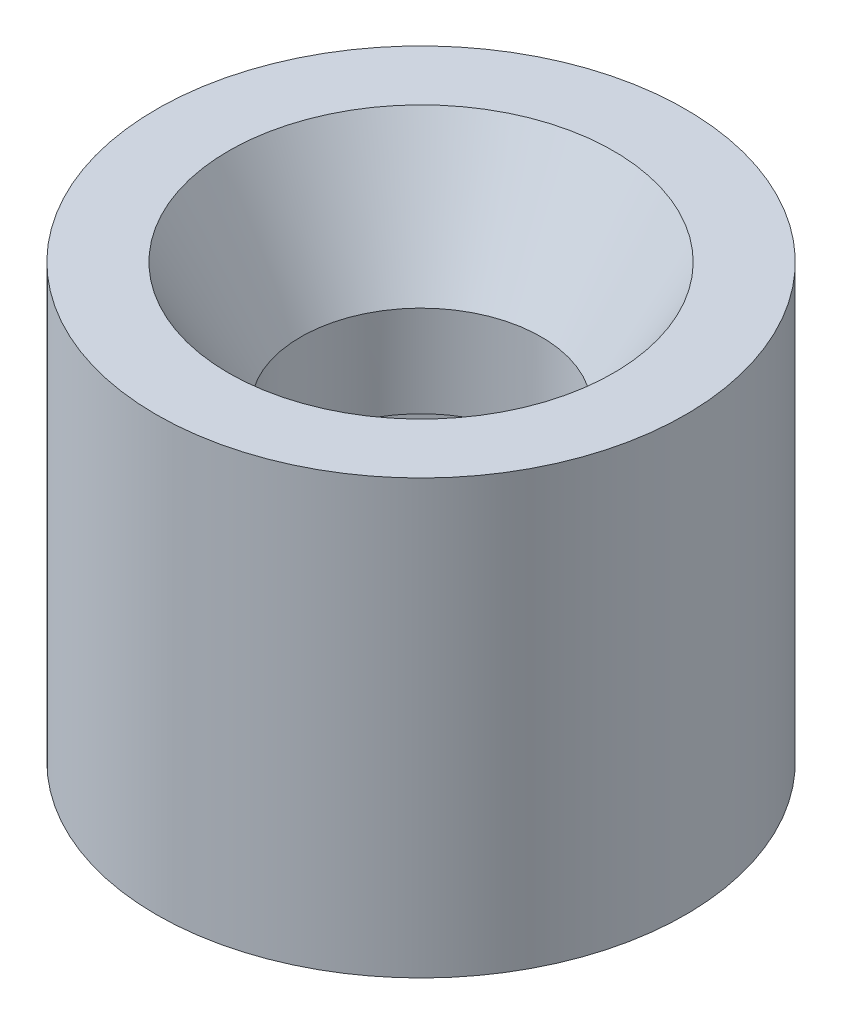
ISO-10303-21;
HEADER;
FILE_DESCRIPTION(('STEP AP214'),'2;1');
FILE_NAME('part.step','',(''),(''),'','','');
FILE_SCHEMA(('AUTOMOTIVE_DESIGN { 1 0 10303 214 1 1 1 1 }'));
ENDSEC;
DATA;
#1=APPLICATION_CONTEXT('core data for automotive mechanical design processes');
#2=APPLICATION_PROTOCOL_DEFINITION('international standard','automotive_design',2000,#1);
#3=PRODUCT_CONTEXT('',#1,'mechanical');
#4=PRODUCT('Part','Part','',(#3));
#5=PRODUCT_RELATED_PRODUCT_CATEGORY('part','',(#4));
#6=PRODUCT_DEFINITION_FORMATION('','',#4);
#7=PRODUCT_DEFINITION_CONTEXT('part definition',#1,'design');
#8=PRODUCT_DEFINITION('design','',#6,#7);
#9=PRODUCT_DEFINITION_SHAPE('','',#8);
#10=(LENGTH_UNIT() NAMED_UNIT(*) SI_UNIT(.MILLI.,.METRE.));
#11=(NAMED_UNIT(*) PLANE_ANGLE_UNIT() SI_UNIT($,.RADIAN.));
#12=(NAMED_UNIT(*) SI_UNIT($,.STERADIAN.) SOLID_ANGLE_UNIT());
#13=UNCERTAINTY_MEASURE_WITH_UNIT(LENGTH_MEASURE(1.E-05),#10,'distance_accuracy_value','');
#14=(GEOMETRIC_REPRESENTATION_CONTEXT(3) GLOBAL_UNCERTAINTY_ASSIGNED_CONTEXT((#13)) GLOBAL_UNIT_ASSIGNED_CONTEXT((#10,
#11,#12)) REPRESENTATION_CONTEXT('',''));
#15=CARTESIAN_POINT('',(0.,0.,0.));
#16=DIRECTION('',(0.,0.,1.));
#17=DIRECTION('',(1.,0.,0.));
#18=AXIS2_PLACEMENT_3D('',#15,#16,#17);
#19=CARTESIAN_POINT('',(0.,11.43,0.));
#20=DIRECTION('',(0.,1.,0.));
#21=DIRECTION('',(0.,0.,1.));
#22=AXIS2_PLACEMENT_3D('',#19,#20,#21);
#23=CYLINDRICAL_SURFACE('',#22,3.175);
#24=CARTESIAN_POINT('',(0.,8.13044321158129,0.));
#25=DIRECTION('',(0.,1.,0.));
#26=DIRECTION('',(0.,0.,1.));
#27=AXIS2_PLACEMENT_3D('',#24,#25,#26);
#28=CIRCLE('',#27,3.175);
#29=CARTESIAN_POINT('',(0.,8.13044321158129,3.175));
#30=VERTEX_POINT('',#29);
#31=EDGE_CURVE('E172',#30,#30,#28,.T.);
#32=ORIENTED_EDGE('',*,*,#31,.T.);
#33=EDGE_LOOP('',(#32));
#34=FACE_BOUND('',#33,.T.);
#35=CARTESIAN_POINT('',(0.,5.715,0.));
#36=DIRECTION('',(0.,-1.,0.));
#37=DIRECTION('',(0.,0.,-1.));
#38=AXIS2_PLACEMENT_3D('',#35,#36,#37);
#39=CIRCLE('',#38,3.175);
#40=CARTESIAN_POINT('',(0.,5.715,-3.175));
#41=VERTEX_POINT('',#40);
#42=EDGE_CURVE('E44',#41,#41,#39,.F.);
#43=ORIENTED_EDGE('',*,*,#42,.F.);
#44=EDGE_LOOP('',(#43));
#45=FACE_BOUND('',#44,.T.);
#46=ADVANCED_FACE('F40',(#34,#45),#23,.F.);
#47=CARTESIAN_POINT('',(0.,11.43,0.));
#48=DIRECTION('',(0.,-1.,0.));
#49=DIRECTION('',(0.,0.,-1.));
#50=AXIS2_PLACEMENT_3D('',#47,#48,#49);
#51=CYLINDRICAL_SURFACE('',#50,6.985);
#52=CARTESIAN_POINT('',(0.,11.43,0.));
#53=DIRECTION('',(0.,1.,0.));
#54=DIRECTION('',(0.,0.,1.));
#55=AXIS2_PLACEMENT_3D('',#52,#53,#54);
#56=CIRCLE('',#55,6.985);
#57=CARTESIAN_POINT('',(0.,11.43,6.985));
#58=VERTEX_POINT('',#57);
#59=EDGE_CURVE('E11',#58,#58,#56,.T.);
#60=ORIENTED_EDGE('',*,*,#59,.F.);
#61=EDGE_LOOP('',(#60));
#62=FACE_BOUND('',#61,.T.);
#63=CARTESIAN_POINT('',(0.,0.,0.));
#64=DIRECTION('',(0.,1.,0.));
#65=DIRECTION('',(0.,0.,1.));
#66=AXIS2_PLACEMENT_3D('',#63,#64,#65);
#67=CIRCLE('',#66,6.985);
#68=CARTESIAN_POINT('',(0.,0.,6.985));
#69=VERTEX_POINT('',#68);
#70=EDGE_CURVE('E50',#69,#69,#67,.T.);
#71=ORIENTED_EDGE('',*,*,#70,.T.);
#72=EDGE_LOOP('',(#71));
#73=FACE_BOUND('',#72,.T.);
#74=ADVANCED_FACE('F42',(#62,#73),#51,.T.);
#75=CARTESIAN_POINT('',(0.,11.43,0.));
#76=DIRECTION('',(0.,1.,0.));
#77=DIRECTION('',(0.,0.,1.));
#78=AXIS2_PLACEMENT_3D('',#75,#76,#77);
#79=PLANE('',#78);
#80=CARTESIAN_POINT('',(0.,11.43,0.));
#81=DIRECTION('',(0.,1.,0.));
#82=DIRECTION('',(0.,0.,1.));
#83=AXIS2_PLACEMENT_3D('',#80,#81,#82);
#84=CIRCLE('',#83,5.08);
#85=CARTESIAN_POINT('',(0.,11.43,5.08));
#86=VERTEX_POINT('',#85);
#87=EDGE_CURVE('E168',#86,#86,#84,.T.);
#88=ORIENTED_EDGE('',*,*,#87,.F.);
#89=EDGE_LOOP('',(#88));
#90=FACE_BOUND('',#89,.T.);
#91=ORIENTED_EDGE('',*,*,#59,.T.);
#92=EDGE_LOOP('',(#91));
#93=FACE_BOUND('',#92,.T.);
#94=ADVANCED_FACE('F184',(#90,#93),#79,.T.);
#95=CARTESIAN_POINT('',(0.,0.,0.));
#96=DIRECTION('',(0.,1.,0.));
#97=DIRECTION('',(0.,0.,1.));
#98=AXIS2_PLACEMENT_3D('',#95,#96,#97);
#99=PLANE('',#98);
#100=DIRECTION('',(0.0786073904965943,0.,0.996905651583597));
#101=VECTOR('',#100,1.);
#102=CARTESIAN_POINT('',(5.43794624986734,0.,-3.73858804678367));
#103=LINE('',#102,#101);
#104=CARTESIAN_POINT('',(5.43794624986734,0.,-3.73858804678367));
#105=VERTEX_POINT('',#104);
#106=CARTESIAN_POINT('',(5.95668534773317,0.,2.8401055734076));
#107=VERTEX_POINT('',#106);
#108=EDGE_CURVE('E140',#105,#107,#103,.T.);
#109=ORIENTED_EDGE('',*,*,#108,.F.);
#110=DIRECTION('',(0.902649314695971,0.,0.430376828696544));
#111=VECTOR('',#110,1.);
#112=CARTESIAN_POINT('',(-0.518739097865837,0.,-6.57869362019127));
#113=LINE('',#112,#111);
#114=CARTESIAN_POINT('',(-0.518739097865837,0.,-6.57869362019127));
#115=VERTEX_POINT('',#114);
#116=EDGE_CURVE('E58',#115,#105,#113,.T.);
#117=ORIENTED_EDGE('',*,*,#116,.F.);
#118=DIRECTION('',(0.824041924199376,0.,-0.566528822887053));
#119=VECTOR('',#118,1.);
#120=CARTESIAN_POINT('',(-5.95668534773317,0.,-2.84010557340759));
#121=LINE('',#120,#119);
#122=CARTESIAN_POINT('',(-5.95668534773317,0.,-2.84010557340759));
#123=VERTEX_POINT('',#122);
#124=EDGE_CURVE('E153',#123,#115,#121,.T.);
#125=ORIENTED_EDGE('',*,*,#124,.F.);
#126=DIRECTION('',(-0.0786073904965946,0.,-0.996905651583597));
#127=VECTOR('',#126,1.);
#128=CARTESIAN_POINT('',(-5.43794624986734,0.,3.73858804678367));
#129=LINE('',#128,#127);
#130=CARTESIAN_POINT('',(-5.43794624986734,0.,3.73858804678367));
#131=VERTEX_POINT('',#130);
#132=EDGE_CURVE('E150',#131,#123,#129,.T.);
#133=ORIENTED_EDGE('',*,*,#132,.F.);
#134=DIRECTION('',(-0.902649314695971,0.,-0.430376828696544));
#135=VECTOR('',#134,1.);
#136=CARTESIAN_POINT('',(0.518739097865839,0.,6.57869362019127));
#137=LINE('',#136,#135);
#138=CARTESIAN_POINT('',(0.518739097865839,0.,6.57869362019127));
#139=VERTEX_POINT('',#138);
#140=EDGE_CURVE('E106',#139,#131,#137,.T.);
#141=ORIENTED_EDGE('',*,*,#140,.F.);
#142=DIRECTION('',(-0.824041924199376,0.,0.566528822887053));
#143=VECTOR('',#142,1.);
#144=CARTESIAN_POINT('',(5.95668534773317,0.,2.8401055734076));
#145=LINE('',#144,#143);
#146=EDGE_CURVE('E144',#107,#139,#145,.T.);
#147=ORIENTED_EDGE('',*,*,#146,.F.);
#148=EDGE_LOOP('',(#109,#117,#125,#133,#141,#147));
#149=FACE_BOUND('',#148,.T.);
#150=ORIENTED_EDGE('',*,*,#70,.F.);
#151=EDGE_LOOP('',(#150));
#152=FACE_BOUND('',#151,.T.);
#153=ADVANCED_FACE('F181',(#149,#152),#99,.F.);
#154=CARTESIAN_POINT('',(0.,11.43,0.));
#155=DIRECTION('',(0.,1.,0.));
#156=DIRECTION('',(0.,0.,1.));
#157=AXIS2_PLACEMENT_3D('',#154,#155,#156);
#158=CONICAL_SURFACE('',#157,5.08,0.523598775598299);
#159=ORIENTED_EDGE('',*,*,#31,.F.);
#160=EDGE_LOOP('',(#159));
#161=FACE_BOUND('',#160,.T.);
#162=ORIENTED_EDGE('',*,*,#87,.T.);
#163=EDGE_LOOP('',(#162));
#164=FACE_BOUND('',#163,.T.);
#165=ADVANCED_FACE('F183',(#161,#164),#158,.F.);
#166=CARTESIAN_POINT('',(0.,5.715,0.));
#167=DIRECTION('',(0.,-1.,0.));
#168=DIRECTION('',(0.,0.,-1.));
#169=AXIS2_PLACEMENT_3D('',#166,#167,#168);
#170=PLANE('',#169);
#171=DIRECTION('',(0.902649314695971,0.,0.430376828696544));
#172=VECTOR('',#171,1.);
#173=CARTESIAN_POINT('',(-0.518739097865837,5.715,-6.57869362019127));
#174=LINE('',#173,#172);
#175=CARTESIAN_POINT('',(-0.518739097865837,5.715,-6.57869362019127));
#176=VERTEX_POINT('',#175);
#177=CARTESIAN_POINT('',(5.43794624986734,5.715,-3.73858804678367));
#178=VERTEX_POINT('',#177);
#179=EDGE_CURVE('E156',#176,#178,#174,.T.);
#180=ORIENTED_EDGE('',*,*,#179,.T.);
#181=DIRECTION('',(0.0786073904965943,0.,0.996905651583597));
#182=VECTOR('',#181,1.);
#183=CARTESIAN_POINT('',(5.43794624986734,5.715,-3.73858804678367));
#184=LINE('',#183,#182);
#185=CARTESIAN_POINT('',(5.95668534773317,5.715,2.8401055734076));
#186=VERTEX_POINT('',#185);
#187=EDGE_CURVE('E132',#178,#186,#184,.T.);
#188=ORIENTED_EDGE('',*,*,#187,.T.);
#189=DIRECTION('',(-0.824041924199376,0.,0.566528822887053));
#190=VECTOR('',#189,1.);
#191=CARTESIAN_POINT('',(5.95668534773317,5.715,2.8401055734076));
#192=LINE('',#191,#190);
#193=CARTESIAN_POINT('',(0.518739097865839,5.715,6.57869362019127));
#194=VERTEX_POINT('',#193);
#195=EDGE_CURVE('E127',#186,#194,#192,.T.);
#196=ORIENTED_EDGE('',*,*,#195,.T.);
#197=DIRECTION('',(-0.902649314695971,0.,-0.430376828696544));
#198=VECTOR('',#197,1.);
#199=CARTESIAN_POINT('',(0.518739097865839,5.715,6.57869362019127));
#200=LINE('',#199,#198);
#201=CARTESIAN_POINT('',(-5.43794624986734,5.715,3.73858804678367));
#202=VERTEX_POINT('',#201);
#203=EDGE_CURVE('E103',#194,#202,#200,.T.);
#204=ORIENTED_EDGE('',*,*,#203,.T.);
#205=DIRECTION('',(-0.0786073904965946,0.,-0.996905651583597));
#206=VECTOR('',#205,1.);
#207=CARTESIAN_POINT('',(-5.43794624986734,5.715,3.73858804678367));
#208=LINE('',#207,#206);
#209=CARTESIAN_POINT('',(-5.95668534773317,5.715,-2.84010557340759));
#210=VERTEX_POINT('',#209);
#211=EDGE_CURVE('E115',#202,#210,#208,.T.);
#212=ORIENTED_EDGE('',*,*,#211,.T.);
#213=DIRECTION('',(0.824041924199376,0.,-0.566528822887053));
#214=VECTOR('',#213,1.);
#215=CARTESIAN_POINT('',(-5.95668534773317,5.715,-2.84010557340759));
#216=LINE('',#215,#214);
#217=EDGE_CURVE('E120',#210,#176,#216,.T.);
#218=ORIENTED_EDGE('',*,*,#217,.T.);
#219=EDGE_LOOP('',(#180,#188,#196,#204,#212,#218));
#220=FACE_BOUND('',#219,.T.);
#221=ORIENTED_EDGE('',*,*,#42,.T.);
#222=EDGE_LOOP('',(#221));
#223=FACE_BOUND('',#222,.T.);
#224=ADVANCED_FACE('F123',(#220,#223),#170,.T.);
#225=CARTESIAN_POINT('',(-0.518739097865837,5.715,-6.57869362019127));
#226=DIRECTION('',(0.430376828696544,0.,-0.902649314695971));
#227=DIRECTION('',(-0.902649314695971,0.,-0.430376828696544));
#228=AXIS2_PLACEMENT_3D('',#225,#226,#227);
#229=PLANE('',#228);
#230=ORIENTED_EDGE('',*,*,#116,.T.);
#231=DIRECTION('',(0.,-1.,0.));
#232=VECTOR('',#231,1.);
#233=CARTESIAN_POINT('',(5.43794624986734,5.715,-3.73858804678367));
#234=LINE('',#233,#232);
#235=EDGE_CURVE('E88',#178,#105,#234,.T.);
#236=ORIENTED_EDGE('',*,*,#235,.F.);
#237=ORIENTED_EDGE('',*,*,#179,.F.);
#238=DIRECTION('',(0.,-1.,0.));
#239=VECTOR('',#238,1.);
#240=CARTESIAN_POINT('',(-0.518739097865837,5.715,-6.57869362019127));
#241=LINE('',#240,#239);
#242=EDGE_CURVE('E66',#176,#115,#241,.T.);
#243=ORIENTED_EDGE('',*,*,#242,.T.);
#244=EDGE_LOOP('',(#230,#236,#237,#243));
#245=FACE_BOUND('',#244,.T.);
#246=ADVANCED_FACE('F204',(#245),#229,.F.);
#247=CARTESIAN_POINT('',(-5.95668534773317,5.715,-2.84010557340759));
#248=DIRECTION('',(-0.566528822887053,0.,-0.824041924199376));
#249=DIRECTION('',(-0.824041924199376,0.,0.566528822887053));
#250=AXIS2_PLACEMENT_3D('',#247,#248,#249);
#251=PLANE('',#250);
#252=ORIENTED_EDGE('',*,*,#124,.T.);
#253=ORIENTED_EDGE('',*,*,#242,.F.);
#254=ORIENTED_EDGE('',*,*,#217,.F.);
#255=DIRECTION('',(0.,-1.,0.));
#256=VECTOR('',#255,1.);
#257=CARTESIAN_POINT('',(-5.95668534773317,5.715,-2.84010557340759));
#258=LINE('',#257,#256);
#259=EDGE_CURVE('E111',#210,#123,#258,.T.);
#260=ORIENTED_EDGE('',*,*,#259,.T.);
#261=EDGE_LOOP('',(#252,#253,#254,#260));
#262=FACE_BOUND('',#261,.T.);
#263=ADVANCED_FACE('F207',(#262),#251,.F.);
#264=CARTESIAN_POINT('',(-5.43794624986734,5.715,3.73858804678367));
#265=DIRECTION('',(-0.996905651583597,0.,0.0786073904965946));
#266=DIRECTION('',(0.0786073904965947,0.,0.996905651583597));
#267=AXIS2_PLACEMENT_3D('',#264,#265,#266);
#268=PLANE('',#267);
#269=ORIENTED_EDGE('',*,*,#132,.T.);
#270=ORIENTED_EDGE('',*,*,#259,.F.);
#271=ORIENTED_EDGE('',*,*,#211,.F.);
#272=DIRECTION('',(0.,-1.,0.));
#273=VECTOR('',#272,1.);
#274=CARTESIAN_POINT('',(-5.43794624986734,5.715,3.73858804678367));
#275=LINE('',#274,#273);
#276=EDGE_CURVE('E99',#202,#131,#275,.T.);
#277=ORIENTED_EDGE('',*,*,#276,.T.);
#278=EDGE_LOOP('',(#269,#270,#271,#277));
#279=FACE_BOUND('',#278,.T.);
#280=ADVANCED_FACE('F116',(#279),#268,.F.);
#281=CARTESIAN_POINT('',(0.518739097865839,5.715,6.57869362019127));
#282=DIRECTION('',(-0.430376828696544,0.,0.902649314695971));
#283=DIRECTION('',(0.902649314695971,0.,0.430376828696544));
#284=AXIS2_PLACEMENT_3D('',#281,#282,#283);
#285=PLANE('',#284);
#286=ORIENTED_EDGE('',*,*,#140,.T.);
#287=ORIENTED_EDGE('',*,*,#276,.F.);
#288=ORIENTED_EDGE('',*,*,#203,.F.);
#289=DIRECTION('',(0.,-1.,0.));
#290=VECTOR('',#289,1.);
#291=CARTESIAN_POINT('',(0.518739097865839,5.715,6.57869362019127));
#292=LINE('',#291,#290);
#293=EDGE_CURVE('E112',#194,#139,#292,.T.);
#294=ORIENTED_EDGE('',*,*,#293,.T.);
#295=EDGE_LOOP('',(#286,#287,#288,#294));
#296=FACE_BOUND('',#295,.T.);
#297=ADVANCED_FACE('F101',(#296),#285,.F.);
#298=CARTESIAN_POINT('',(5.95668534773317,5.715,2.8401055734076));
#299=DIRECTION('',(0.566528822887053,0.,0.824041924199376));
#300=DIRECTION('',(0.824041924199376,0.,-0.566528822887053));
#301=AXIS2_PLACEMENT_3D('',#298,#299,#300);
#302=PLANE('',#301);
#303=ORIENTED_EDGE('',*,*,#146,.T.);
#304=ORIENTED_EDGE('',*,*,#293,.F.);
#305=ORIENTED_EDGE('',*,*,#195,.F.);
#306=DIRECTION('',(0.,-1.,0.));
#307=VECTOR('',#306,1.);
#308=CARTESIAN_POINT('',(5.95668534773317,5.715,2.8401055734076));
#309=LINE('',#308,#307);
#310=EDGE_CURVE('E163',#186,#107,#309,.T.);
#311=ORIENTED_EDGE('',*,*,#310,.T.);
#312=EDGE_LOOP('',(#303,#304,#305,#311));
#313=FACE_BOUND('',#312,.T.);
#314=ADVANCED_FACE('F211',(#313),#302,.F.);
#315=CARTESIAN_POINT('',(5.43794624986734,5.715,-3.73858804678367));
#316=DIRECTION('',(0.996905651583597,0.,-0.0786073904965943));
#317=DIRECTION('',(-0.0786073904965943,0.,-0.996905651583597));
#318=AXIS2_PLACEMENT_3D('',#315,#316,#317);
#319=PLANE('',#318);
#320=ORIENTED_EDGE('',*,*,#108,.T.);
#321=ORIENTED_EDGE('',*,*,#310,.F.);
#322=ORIENTED_EDGE('',*,*,#187,.F.);
#323=ORIENTED_EDGE('',*,*,#235,.T.);
#324=EDGE_LOOP('',(#320,#321,#322,#323));
#325=FACE_BOUND('',#324,.T.);
#326=ADVANCED_FACE('F208',(#325),#319,.F.);
#327=CLOSED_SHELL('',(#46,#74,#94,#153,#165,#224,#246,#263,#280,#297,#314,#326));
#328=MANIFOLD_SOLID_BREP('B2',#327);
#329=ADVANCED_BREP_SHAPE_REPRESENTATION('',(#18,#328),#14);
#330=SHAPE_DEFINITION_REPRESENTATION(#9,#329);
ENDSEC;
END-ISO-10303-21;
